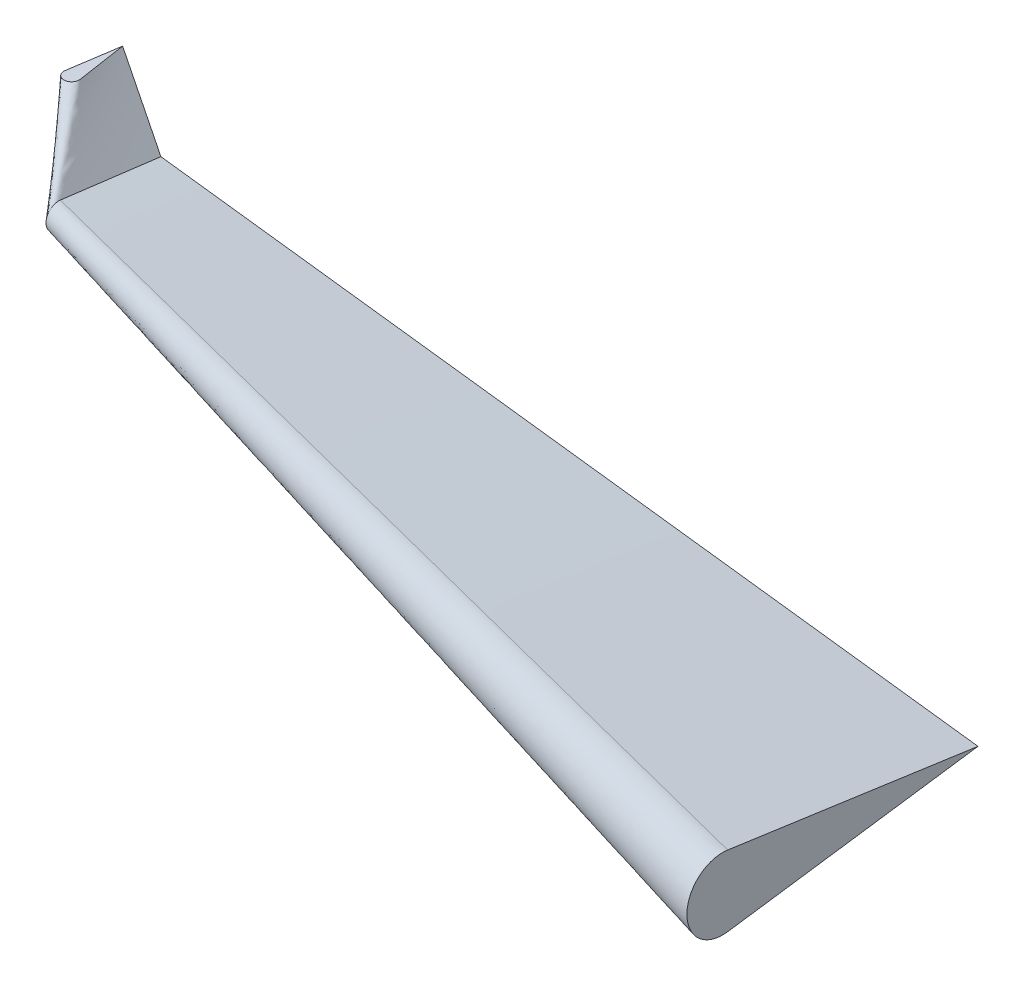
ISO-10303-21;
HEADER;
FILE_DESCRIPTION(('STEP AP214'),'2;1');
FILE_NAME('part.step','',(''),(''),'','','');
FILE_SCHEMA(('AUTOMOTIVE_DESIGN { 1 0 10303 214 1 1 1 1 }'));
ENDSEC;
DATA;
#1=APPLICATION_CONTEXT('core data for automotive mechanical design processes');
#2=APPLICATION_PROTOCOL_DEFINITION('international standard','automotive_design',2000,#1);
#3=PRODUCT_CONTEXT('',#1,'mechanical');
#4=PRODUCT('Part','Part','',(#3));
#5=PRODUCT_RELATED_PRODUCT_CATEGORY('part','',(#4));
#6=PRODUCT_DEFINITION_FORMATION('','',#4);
#7=PRODUCT_DEFINITION_CONTEXT('part definition',#1,'design');
#8=PRODUCT_DEFINITION('design','',#6,#7);
#9=PRODUCT_DEFINITION_SHAPE('','',#8);
#10=(LENGTH_UNIT() NAMED_UNIT(*) SI_UNIT(.MILLI.,.METRE.));
#11=(NAMED_UNIT(*) PLANE_ANGLE_UNIT() SI_UNIT($,.RADIAN.));
#12=(NAMED_UNIT(*) SI_UNIT($,.STERADIAN.) SOLID_ANGLE_UNIT());
#13=UNCERTAINTY_MEASURE_WITH_UNIT(LENGTH_MEASURE(1.E-05),#10,'distance_accuracy_value','');
#14=(GEOMETRIC_REPRESENTATION_CONTEXT(3) GLOBAL_UNCERTAINTY_ASSIGNED_CONTEXT((#13)) GLOBAL_UNIT_ASSIGNED_CONTEXT((#10,
#11,#12)) REPRESENTATION_CONTEXT('',''));
#15=CARTESIAN_POINT('',(0.,0.,0.));
#16=DIRECTION('',(0.,0.,1.));
#17=DIRECTION('',(1.,0.,0.));
#18=AXIS2_PLACEMENT_3D('',#15,#16,#17);
#19=CARTESIAN_POINT('',(-200.,-50.,-1400.));
#20=DIRECTION('',(1.,0.,0.));
#21=DIRECTION('',(0.,0.,-1.));
#22=AXIS2_PLACEMENT_3D('',#19,#20,#21);
#23=PLANE('',#22);
#24=CARTESIAN_POINT('',(-200.,-50.,-1400.));
#25=DIRECTION('',(1.,0.,0.));
#26=DIRECTION('',(0.,0.,-1.));
#27=AXIS2_PLACEMENT_3D('',#24,#25,#26);
#28=CIRCLE('',#27,70.);
#29=CARTESIAN_POINT('',(-200.,19.3106052491248,-1409.8));
#30=VERTEX_POINT('',#29);
#31=CARTESIAN_POINT('',(-200.,-119.310605249126,-1409.79999999999));
#32=VERTEX_POINT('',#31);
#33=EDGE_CURVE('E260',#30,#32,#28,.T.);
#34=ORIENTED_EDGE('',*,*,#33,.T.);
#35=DIRECTION('',(0.,0.14,-0.990151503558925));
#36=VECTOR('',#35,1.);
#37=CARTESIAN_POINT('',(-200.,-50.,-1900.));
#38=LINE('',#37,#36);
#39=CARTESIAN_POINT('',(-200.,-50.,-1900.));
#40=VERTEX_POINT('',#39);
#41=EDGE_CURVE('E126',#32,#40,#38,.T.);
#42=ORIENTED_EDGE('',*,*,#41,.T.);
#43=DIRECTION('',(0.,0.14,0.990151503558925));
#44=VECTOR('',#43,1.);
#45=CARTESIAN_POINT('',(-200.,19.3106052491248,-1409.8));
#46=LINE('',#45,#44);
#47=EDGE_CURVE('E12',#40,#30,#46,.T.);
#48=ORIENTED_EDGE('',*,*,#47,.T.);
#49=EDGE_LOOP('',(#34,#42,#48));
#50=FACE_BOUND('',#49,.T.);
#51=ADVANCED_FACE('F116',(#50),#23,.T.);
#52=CARTESIAN_POINT('',(-2000.,-25.1960814587694,-1903.125));
#53=CARTESIAN_POINT('',(-200.,19.3106052491248,-1409.8));
#54=CARTESIAN_POINT('',(-2000.,-24.9653104565377,-1901.29331195487));
#55=CARTESIAN_POINT('',(-200.,19.9809990474367,-1405.05863266161));
#56=CARTESIAN_POINT('',(-2000.,-24.9150024310118,-1897.61196030553));
#57=CARTESIAN_POINT('',(-200.,20.355213584653,-1395.36732208963));
#58=CARTESIAN_POINT('',(-2000.,-26.0170718509449,-1892.28297129427));
#59=CARTESIAN_POINT('',(-200.,17.8661066189093,-1380.83479945944));
#60=CARTESIAN_POINT('',(-2000.,-28.2042565459087,-1887.37583841677));
#61=CARTESIAN_POINT('',(-200.,12.3264593440015,-1366.98257225013));
#62=CARTESIAN_POINT('',(-2000.,-31.342453634427,-1883.0788261901));
#63=CARTESIAN_POINT('',(-200.,3.89755295426092,-1354.48986589717));
#64=CARTESIAN_POINT('',(-2000.,-35.2822402059315,-1879.56856747573));
#65=CARTESIAN_POINT('',(-200.,-7.0934414334213,-1343.99767716777));
#66=CARTESIAN_POINT('',(-2000.,-39.8348235008134,-1876.95857210501));
#67=CARTESIAN_POINT('',(-200.,-20.1647059414889,-1336.06326232234));
#68=CARTESIAN_POINT('',(-2000.,-44.8114107594642,-1875.36234990932));
#69=CARTESIAN_POINT('',(-200.,-34.7030390915181,-1331.1192777342));
#70=CARTESIAN_POINT('',(-2000.,-49.9999999999994,-1874.81768210524));
#71=CARTESIAN_POINT('',(-200.,-49.9999999999992,-1329.43996464842));
#72=CARTESIAN_POINT('',(-2000.,-55.188589240535,-1875.36234990932));
#73=CARTESIAN_POINT('',(-199.999999999999,-65.2969609084799,-1331.1192777342));
#74=CARTESIAN_POINT('',(-2000.,-60.1651764991861,-1876.95857210501));
#75=CARTESIAN_POINT('',(-200.000000000001,-79.8352940585099,-1336.06326232234));
#76=CARTESIAN_POINT('',(-2000.,-64.717759794068,-1879.56856747573));
#77=CARTESIAN_POINT('',(-199.999999999999,-92.9065585665767,-1343.99767716777));
#78=CARTESIAN_POINT('',(-2000.,-68.6575463655723,-1883.0788261901));
#79=CARTESIAN_POINT('',(-200.000000000001,-103.897552954261,-1354.48986589718));
#80=CARTESIAN_POINT('',(-2000.,-71.7957434540909,-1887.37583841676));
#81=CARTESIAN_POINT('',(-199.999999999999,-112.326459344,-1366.98257225013));
#82=CARTESIAN_POINT('',(-2000.,-73.9829281490548,-1892.28297129428));
#83=CARTESIAN_POINT('',(-200.000000000001,-117.866106618909,-1380.83479945944));
#84=CARTESIAN_POINT('',(-2000.,-75.0849975689882,-1897.61196030552));
#85=CARTESIAN_POINT('',(-200.,-120.355213584653,-1395.36732208962));
#86=CARTESIAN_POINT('',(-2000.,-75.0346895434623,-1901.29331195487));
#87=CARTESIAN_POINT('',(-200.,-119.980999047437,-1405.05863266161));
#88=CARTESIAN_POINT('',(-2000.,-72.776611347622,-1919.21625199626));
#89=CARTESIAN_POINT('',(-200.,-113.421242385544,-1451.4525821027));
#90=CARTESIAN_POINT('',(-2000.,-68.6641938639956,-1951.85755384311));
#91=CARTESIAN_POINT('',(-200.,-101.817585209031,-1533.51957210346));
#92=CARTESIAN_POINT('',(-2000.,-62.4019592706154,-2001.5625));
#93=CARTESIAN_POINT('',(-200.,-84.6553026245624,-1654.9));
#94=CARTESIAN_POINT('',(-2000.,-56.1397246772349,-2051.26744615689));
#95=CARTESIAN_POINT('',(-200.,-67.4930200400932,-1776.28042789654));
#96=CARTESIAN_POINT('',(-2000.,-52.0273071936086,-2083.90874800374));
#97=CARTESIAN_POINT('',(-200.,-55.8893628635803,-1858.3474178973));
#98=CARTESIAN_POINT('',(-2000.,-50.,-2100.));
#99=CARTESIAN_POINT('',(-200.,-50.,-1900.));
#100=B_SPLINE_SURFACE_WITH_KNOTS('',3,1,((#52,#53),(#54,#55),(#56,#57),(#58,#59),(#60,#61),(#62,
#63),(#64,#65),(#66,#67),(#68,#69),(#70,#71),(#72,#73),(#74,#75),(#76,#77),(#78,#79),(#80,#81),
(#82,#83),(#84,#85),(#86,#87),(#88,#89),(#90,#91),(#92,#93),(#94,#95),(#96,#97),(#98,#99)),
.UNSPECIFIED.,.F.,.F.,.F.,(4,1,1,1,1,1,1,1,1,1,1,1,1,1,1,1,2,1,1,1,4),(2,2),(0.,
0.0195542716028089,0.0391085432056179,0.0586628148084268,0.0782170864112357,0.0977713580140447,
0.117325629616854,0.136879901219663,0.156434172822471,0.17598844442528,0.195542716028089,
0.215096987630898,0.234651259233707,0.254205530836516,0.273759802439325,0.293314074042134,
0.312868345644943,0.484651259233707,0.656434172822472,0.828217086411236,1.),(0.,1.),.UNSPECIFIED.);
#101=CARTESIAN_POINT('',(-2000.,-50.,-1900.));
#102=DIRECTION('',(1.,0.,0.));
#103=DIRECTION('',(0.,0.,1.));
#104=AXIS2_PLACEMENT_3D('',#101,#102,#103);
#105=CIRCLE('',#104,25.);
#106=CARTESIAN_POINT('',(-2000.,-25.1960814587694,-1903.125));
#107=VERTEX_POINT('',#106);
#108=CARTESIAN_POINT('',(-2000.,-74.8039185412306,-1903.125));
#109=VERTEX_POINT('',#108);
#110=EDGE_CURVE('E120',#107,#109,#105,.T.);
#111=DIRECTION('',(0.,0.125,-0.992156741649221));
#112=VECTOR('',#111,1.);
#113=CARTESIAN_POINT('',(-2000.,-50.,-2100.));
#114=LINE('',#113,#112);
#115=CARTESIAN_POINT('',(-2000.,-50.,-2100.));
#116=VERTEX_POINT('',#115);
#117=EDGE_CURVE('E191',#109,#116,#114,.T.);
#118=DIRECTION('',(0.993883734673619,0.,0.110431526074846));
#119=VECTOR('',#118,1.);
#120=CARTESIAN_POINT('',(-1100.,-50.,-2000.));
#121=LINE('',#120,#119);
#122=EDGE_CURVE('E134',#116,#40,#121,.T.);
#123=DIRECTION('',(-0.96416038147339,-0.0238397689079999,-0.264246900105756));
#124=VECTOR('',#123,1.);
#125=CARTESIAN_POINT('',(-1100.,-2.94273810482232,-1656.4625));
#126=LINE('',#125,#124);
#127=EDGE_CURVE('E261',#30,#107,#126,.T.);
#128=ORIENTED_EDGE('',*,*,#110,.T.);
#129=ORIENTED_EDGE('',*,*,#117,.T.);
#130=ORIENTED_EDGE('',*,*,#122,.T.);
#131=ORIENTED_EDGE('',*,*,#41,.F.);
#132=ORIENTED_EDGE('',*,*,#33,.F.);
#133=ORIENTED_EDGE('',*,*,#127,.T.);
#134=EDGE_LOOP('',(#128,#129,#130,#131,#132,#133));
#135=FACE_BOUND('',#134,.T.);
#136=ADVANCED_FACE('F273',(#135),#100,.T.);
#137=CARTESIAN_POINT('',(-2000.,-50.,-2100.));
#138=CARTESIAN_POINT('',(-200.,-50.,-1900.));
#139=CARTESIAN_POINT('',(-2000.,-25.1960814587694,-1903.125));
#140=CARTESIAN_POINT('',(-200.,19.3106052491248,-1409.8));
#141=B_SPLINE_SURFACE_WITH_KNOTS('',1,1,((#137,#138),(#139,#140)),.UNSPECIFIED.,.F.,.F.,.F.,(2,
2),(2,2),(0.,1.),(0.,1.),.UNSPECIFIED.);
#142=DIRECTION('',(0.,0.125,0.992156741649221));
#143=VECTOR('',#142,1.);
#144=CARTESIAN_POINT('',(-2000.,-25.1960814587694,-1903.125));
#145=LINE('',#144,#143);
#146=EDGE_CURVE('E324',#116,#107,#145,.T.);
#147=ORIENTED_EDGE('',*,*,#146,.T.);
#148=ORIENTED_EDGE('',*,*,#127,.F.);
#149=ORIENTED_EDGE('',*,*,#47,.F.);
#150=ORIENTED_EDGE('',*,*,#122,.F.);
#151=EDGE_LOOP('',(#147,#148,#149,#150));
#152=FACE_BOUND('',#151,.T.);
#153=ADVANCED_FACE('F283',(#152),#141,.T.);
#154=CARTESIAN_POINT('',(-2100.,75.,-2024.99923776743));
#155=DIRECTION('',(0.,1.,0.));
#156=DIRECTION('',(0.,0.,1.));
#157=AXIS2_PLACEMENT_3D('',#154,#155,#156);
#158=PLANE('',#157);
#159=CARTESIAN_POINT('',(-2100.,75.,-2024.99923776743));
#160=DIRECTION('',(0.,1.,0.));
#161=DIRECTION('',(0.,0.,1.));
#162=AXIS2_PLACEMENT_3D('',#159,#160,#161);
#163=CIRCLE('',#162,15.0000000000001);
#164=CARTESIAN_POINT('',(-2114.83028994996,75.,-2027.24923776743));
#165=VERTEX_POINT('',#164);
#166=CARTESIAN_POINT('',(-2085.16971004999,75.,-2027.2492377671));
#167=VERTEX_POINT('',#166);
#168=EDGE_CURVE('E169',#165,#167,#163,.T.);
#169=ORIENTED_EDGE('',*,*,#168,.T.);
#170=DIRECTION('',(-0.150000000000005,0.,-0.988685996664258));
#171=VECTOR('',#170,1.);
#172=CARTESIAN_POINT('',(-2100.,75.,-2124.99923776743));
#173=LINE('',#172,#171);
#174=CARTESIAN_POINT('',(-2100.,75.,-2124.99923776743));
#175=VERTEX_POINT('',#174);
#176=EDGE_CURVE('E171',#167,#175,#173,.T.);
#177=ORIENTED_EDGE('',*,*,#176,.T.);
#178=DIRECTION('',(-0.149999999999996,0.,0.98868599666426));
#179=VECTOR('',#178,1.);
#180=CARTESIAN_POINT('',(-2114.83028994996,75.,-2027.24923776743));
#181=LINE('',#180,#179);
#182=EDGE_CURVE('E165',#175,#165,#181,.T.);
#183=ORIENTED_EDGE('',*,*,#182,.T.);
#184=EDGE_LOOP('',(#169,#177,#183));
#185=FACE_BOUND('',#184,.T.);
#186=ADVANCED_FACE('F168',(#185),#158,.T.);
#187=CARTESIAN_POINT('',(-2000.,-74.8039185412306,-1903.125));
#188=CARTESIAN_POINT('',(-2114.83028994996,75.,-2027.24923776743));
#189=CARTESIAN_POINT('',(-2000.,-75.0410933309872,-1901.24248346715));
#190=CARTESIAN_POINT('',(-2114.98152546866,75.,-2026.25240817053));
#191=CARTESIAN_POINT('',(-2000.,-75.0781542082298,-1897.48169317332));
#192=CARTESIAN_POINT('',(-2115.08329918996,74.9999999999999,-2024.20447437069));
#193=CARTESIAN_POINT('',(-2000.,-73.9259965561045,-1892.09534334393));
#194=CARTESIAN_POINT('',(-2114.60253693545,74.9999999999999,-2021.10651623158));
#195=CARTESIAN_POINT('',(-2000.,-71.6858069381048,-1887.18930128141));
#196=CARTESIAN_POINT('',(-2113.45702095632,75.0000000000001,-2018.11926703191));
#197=CARTESIAN_POINT('',(-2000.,-68.5158920554212,-1882.92621046943));
#198=CARTESIAN_POINT('',(-2111.68143317881,74.9999999999999,-2015.40190914777));
#199=CARTESIAN_POINT('',(-2000.,-64.5745586092443,-1879.46871439167));
#200=CARTESIAN_POINT('',(-2109.3282536817,75.,-2013.09878326202));
#201=CARTESIAN_POINT('',(-2000.,-60.0483370781366,-1876.91242143373));
#202=CARTESIAN_POINT('',(-2106.50318623216,74.9999999999999,-2011.34601878668));
#203=CARTESIAN_POINT('',(-2000.,-55.1237579406606,-1875.35293998123));
#204=CARTESIAN_POINT('',(-2103.33939693277,75.0000000000001,-2010.24824822664));
#205=CARTESIAN_POINT('',(-2000.,-50.0000000000005,-1874.82240213133));
#206=CARTESIAN_POINT('',(-2100.,74.9999999999998,-2009.87465596816));
#207=CARTESIAN_POINT('',(-2000.,-44.8762420593404,-1875.35293998123));
#208=CARTESIAN_POINT('',(-2096.66060306723,75.0000000000002,-2010.24824822664));
#209=CARTESIAN_POINT('',(-2000.,-39.9516629218644,-1876.91242143373));
#210=CARTESIAN_POINT('',(-2093.49681376783,74.9999999999998,-2011.34601878668));
#211=CARTESIAN_POINT('',(-2000.,-35.4254413907564,-1879.46871439167));
#212=CARTESIAN_POINT('',(-2090.67174631831,75.0000000000001,-2013.09878326202));
#213=CARTESIAN_POINT('',(-2000.,-31.4841079445793,-1882.92621046943));
#214=CARTESIAN_POINT('',(-2088.31856682119,74.9999999999999,-2015.40190914778));
#215=CARTESIAN_POINT('',(-2000.,-28.3141930618956,-1887.18930128141));
#216=CARTESIAN_POINT('',(-2086.54297904368,75.0000000000001,-2018.1192670319));
#217=CARTESIAN_POINT('',(-2000.,-26.0740034438958,-1892.09534334393));
#218=CARTESIAN_POINT('',(-2085.39746306455,74.9999999999999,-2021.10651623158));
#219=CARTESIAN_POINT('',(-2000.,-24.9218457917701,-1897.48169317333));
#220=CARTESIAN_POINT('',(-2084.91670081004,75.,-2024.20447437069));
#221=CARTESIAN_POINT('',(-2000.,-24.9589066690128,-1901.24248346715));
#222=CARTESIAN_POINT('',(-2085.01847453134,75.,-2026.25240817053));
#223=CARTESIAN_POINT('',(-2000.,-27.1977754664446,-1919.01295363547));
#224=CARTESIAN_POINT('',(-2086.44613719024,75.,-2035.66247536261));
#225=CARTESIAN_POINT('',(-2000.,-31.294377239065,-1951.52872216793));
#226=CARTESIAN_POINT('',(-2088.93527838989,74.9999999999999,-2052.06900234805));
#227=CARTESIAN_POINT('',(-2000.,-37.5980407293847,-2001.5625));
#228=CARTESIAN_POINT('',(-2092.58485502502,75.0000000000001,-2076.12423776743));
#229=CARTESIAN_POINT('',(-2000.,-43.9017042197043,-2051.59627783207));
#230=CARTESIAN_POINT('',(-2096.23443166015,74.9999999999999,-2100.17947318681));
#231=CARTESIAN_POINT('',(-2000.,-47.9983059923248,-2084.11204636453));
#232=CARTESIAN_POINT('',(-2098.7235728598,75.,-2116.58600017225));
#233=CARTESIAN_POINT('',(-2000.,-50.,-2100.));
#234=CARTESIAN_POINT('',(-2100.,75.,-2124.99923776743));
#235=B_SPLINE_SURFACE_WITH_KNOTS('',3,1,((#187,#188),(#189,#190),(#191,#192),(#193,#194),(#195,
#196),(#197,#198),(#199,#200),(#201,#202),(#203,#204),(#205,#206),(#207,#208),(#209,#210),(#211,
#212),(#213,#214),(#215,#216),(#217,#218),(#219,#220),(#221,#222),(#223,#224),(#225,#226),(#227,
#228),(#229,#230),(#231,#232),(#233,#234)),.UNSPECIFIED.,.F.,.F.,.F.,(4,1,1,1,1,1,1,1,1,1,1,1,1,
1,1,1,2,1,1,1,4),(2,2),(0.,0.0200964699613469,0.0401929399226938,0.0602894098840407,
0.0803858798453876,0.100482349806735,0.120578819768081,0.140675289729428,0.160771759690775,
0.180868229652122,0.200964699613469,0.221061169574816,0.241157639536163,0.26125410949751,
0.281350579458857,0.301447049420204,0.321543519381551,0.491157639536163,0.660771759690775,
0.830385879845388,1.),(0.,1.),.UNSPECIFIED.);
#236=DIRECTION('',(-0.617213847899317,0.771517309874142,-0.154298757369872));
#237=VECTOR('',#236,1.);
#238=CARTESIAN_POINT('',(-2050.,12.5,-2112.49961888372));
#239=LINE('',#238,#237);
#240=EDGE_CURVE('E192',#116,#175,#239,.T.);
#241=DIRECTION('',(0.508307484001894,-0.66312166380924,0.549448050951616));
#242=VECTOR('',#241,1.);
#243=CARTESIAN_POINT('',(-2057.41514497498,0.098040729384713,-1965.18711888372));
#244=LINE('',#243,#242);
#245=EDGE_CURVE('E177',#165,#109,#244,.T.);
#246=ORIENTED_EDGE('',*,*,#110,.F.);
#247=ORIENTED_EDGE('',*,*,#146,.F.);
#248=ORIENTED_EDGE('',*,*,#240,.T.);
#249=ORIENTED_EDGE('',*,*,#176,.F.);
#250=ORIENTED_EDGE('',*,*,#168,.F.);
#251=ORIENTED_EDGE('',*,*,#245,.T.);
#252=EDGE_LOOP('',(#246,#247,#248,#249,#250,#251));
#253=FACE_BOUND('',#252,.T.);
#254=ADVANCED_FACE('F184',(#253),#235,.T.);
#255=CARTESIAN_POINT('',(-2000.,-50.,-2100.));
#256=CARTESIAN_POINT('',(-2100.,75.,-2124.99923776743));
#257=CARTESIAN_POINT('',(-2000.,-74.8039185412306,-1903.125));
#258=CARTESIAN_POINT('',(-2114.83028994996,75.,-2027.24923776743));
#259=B_SPLINE_SURFACE_WITH_KNOTS('',1,1,((#255,#256),(#257,#258)),.UNSPECIFIED.,.F.,.F.,.F.,(2,
2),(2,2),(0.,1.),(0.,1.),.UNSPECIFIED.);
#260=ORIENTED_EDGE('',*,*,#117,.F.);
#261=ORIENTED_EDGE('',*,*,#245,.F.);
#262=ORIENTED_EDGE('',*,*,#182,.F.);
#263=ORIENTED_EDGE('',*,*,#240,.F.);
#264=EDGE_LOOP('',(#260,#261,#262,#263));
#265=FACE_BOUND('',#264,.T.);
#266=ADVANCED_FACE('F190',(#265),#259,.T.);
#267=CLOSED_SHELL('',(#51,#136,#153,#186,#254,#266));
#268=MANIFOLD_SOLID_BREP('B2',#267);
#269=ADVANCED_BREP_SHAPE_REPRESENTATION('',(#18,#268),#14);
#270=SHAPE_DEFINITION_REPRESENTATION(#9,#269);
ENDSEC;
END-ISO-10303-21;
